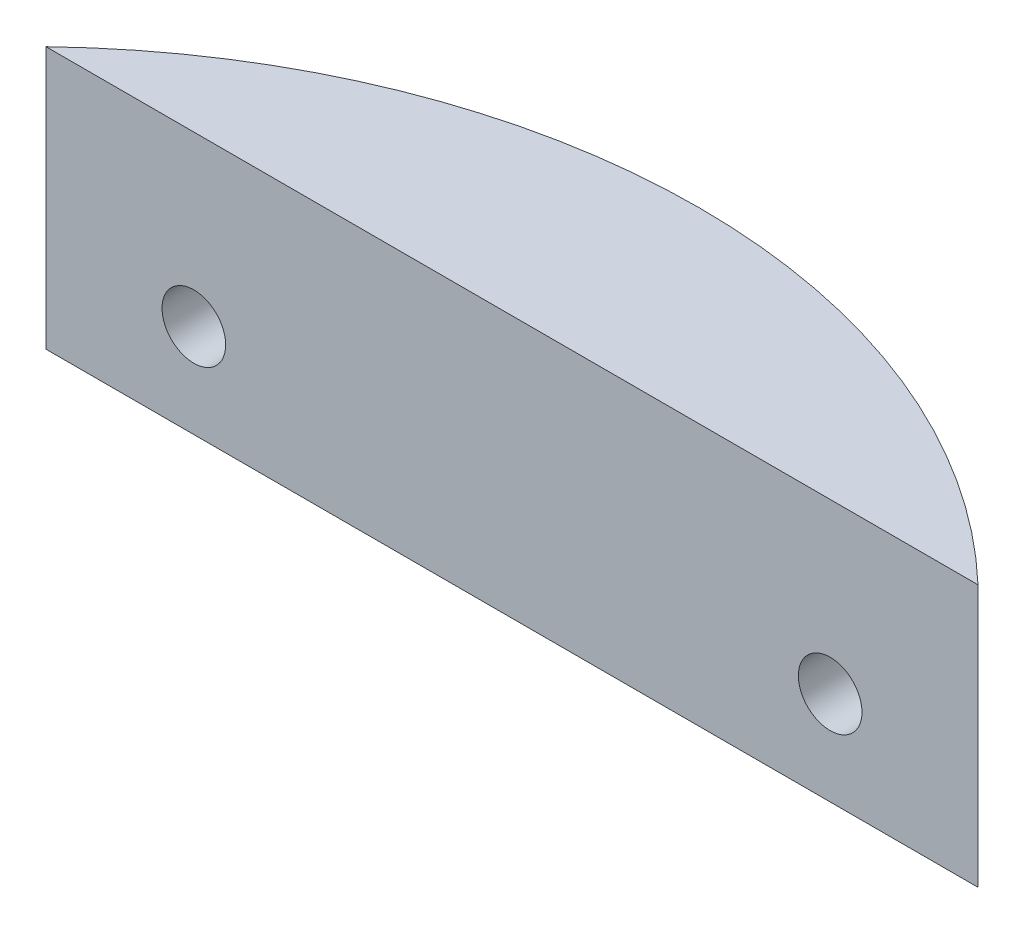
ISO-10303-21;
HEADER;
FILE_DESCRIPTION(('STEP AP214'),'2;1');
FILE_NAME('part.step','',(''),(''),'','','');
FILE_SCHEMA(('AUTOMOTIVE_DESIGN { 1 0 10303 214 1 1 1 1 }'));
ENDSEC;
DATA;
#1=APPLICATION_CONTEXT('core data for automotive mechanical design processes');
#2=APPLICATION_PROTOCOL_DEFINITION('international standard','automotive_design',2000,#1);
#3=PRODUCT_CONTEXT('',#1,'mechanical');
#4=PRODUCT('Part','Part','',(#3));
#5=PRODUCT_RELATED_PRODUCT_CATEGORY('part','',(#4));
#6=PRODUCT_DEFINITION_FORMATION('','',#4);
#7=PRODUCT_DEFINITION_CONTEXT('part definition',#1,'design');
#8=PRODUCT_DEFINITION('design','',#6,#7);
#9=PRODUCT_DEFINITION_SHAPE('','',#8);
#10=(LENGTH_UNIT() NAMED_UNIT(*) SI_UNIT(.MILLI.,.METRE.));
#11=(NAMED_UNIT(*) PLANE_ANGLE_UNIT() SI_UNIT($,.RADIAN.));
#12=(NAMED_UNIT(*) SI_UNIT($,.STERADIAN.) SOLID_ANGLE_UNIT());
#13=UNCERTAINTY_MEASURE_WITH_UNIT(LENGTH_MEASURE(1.E-05),#10,'distance_accuracy_value','');
#14=(GEOMETRIC_REPRESENTATION_CONTEXT(3) GLOBAL_UNCERTAINTY_ASSIGNED_CONTEXT((#13)) GLOBAL_UNIT_ASSIGNED_CONTEXT((#10,
#11,#12)) REPRESENTATION_CONTEXT('',''));
#15=CARTESIAN_POINT('',(0.,0.,0.));
#16=DIRECTION('',(0.,0.,1.));
#17=DIRECTION('',(1.,0.,0.));
#18=AXIS2_PLACEMENT_3D('',#15,#16,#17);
#19=CARTESIAN_POINT('',(0.,35.,0.));
#20=DIRECTION('',(0.,-1.,0.));
#21=DIRECTION('',(0.,0.,-1.));
#22=AXIS2_PLACEMENT_3D('',#19,#20,#21);
#23=CYLINDRICAL_SURFACE('',#22,90.);
#24=CARTESIAN_POINT('',(0.,0.,0.));
#25=DIRECTION('',(0.,1.,0.));
#26=DIRECTION('',(0.,0.,-1.));
#27=AXIS2_PLACEMENT_3D('',#24,#25,#26);
#28=CIRCLE('',#27,90.);
#29=CARTESIAN_POINT('',(62.2494979899437,0.,-65.));
#30=VERTEX_POINT('',#29);
#31=CARTESIAN_POINT('',(-62.2494979899437,0.,-65.));
#32=VERTEX_POINT('',#31);
#33=EDGE_CURVE('E66',#30,#32,#28,.T.);
#34=ORIENTED_EDGE('',*,*,#33,.T.);
#35=DIRECTION('',(0.,-1.,0.));
#36=VECTOR('',#35,1.);
#37=CARTESIAN_POINT('',(-62.2494979899437,35.,-65.));
#38=LINE('',#37,#36);
#39=CARTESIAN_POINT('',(-62.2494979899437,35.,-65.));
#40=VERTEX_POINT('',#39);
#41=EDGE_CURVE('E11',#40,#32,#38,.T.);
#42=ORIENTED_EDGE('',*,*,#41,.F.);
#43=CARTESIAN_POINT('',(0.,35.,0.));
#44=DIRECTION('',(0.,1.,0.));
#45=DIRECTION('',(0.,0.,-1.));
#46=AXIS2_PLACEMENT_3D('',#43,#44,#45);
#47=CIRCLE('',#46,90.);
#48=CARTESIAN_POINT('',(62.2494979899437,35.,-65.));
#49=VERTEX_POINT('',#48);
#50=EDGE_CURVE('E65',#49,#40,#47,.T.);
#51=ORIENTED_EDGE('',*,*,#50,.F.);
#52=DIRECTION('',(0.,-1.,0.));
#53=VECTOR('',#52,1.);
#54=CARTESIAN_POINT('',(62.2494979899437,35.,-65.));
#55=LINE('',#54,#53);
#56=EDGE_CURVE('E43',#49,#30,#55,.T.);
#57=ORIENTED_EDGE('',*,*,#56,.T.);
#58=EDGE_LOOP('',(#34,#42,#51,#57));
#59=FACE_BOUND('',#58,.T.);
#60=ADVANCED_FACE('F35',(#59),#23,.T.);
#61=CARTESIAN_POINT('',(-62.2494979899437,35.,-65.));
#62=DIRECTION('',(0.,0.,-1.));
#63=DIRECTION('',(-1.,0.,0.));
#64=AXIS2_PLACEMENT_3D('',#61,#62,#63);
#65=PLANE('',#64);
#66=CARTESIAN_POINT('',(42.5,12.5,-65.));
#67=DIRECTION('',(0.,0.,1.));
#68=DIRECTION('',(1.,0.,0.));
#69=AXIS2_PLACEMENT_3D('',#66,#67,#68);
#70=CIRCLE('',#69,4.25000000000001);
#71=CARTESIAN_POINT('',(46.75,12.5,-65.));
#72=VERTEX_POINT('',#71);
#73=EDGE_CURVE('E81',#72,#72,#70,.T.);
#74=ORIENTED_EDGE('',*,*,#73,.F.);
#75=EDGE_LOOP('',(#74));
#76=FACE_BOUND('',#75,.T.);
#77=CARTESIAN_POINT('',(-42.5,12.5,-65.));
#78=DIRECTION('',(0.,0.,1.));
#79=DIRECTION('',(1.,0.,0.));
#80=AXIS2_PLACEMENT_3D('',#77,#78,#79);
#81=CIRCLE('',#80,4.25000000000001);
#82=CARTESIAN_POINT('',(-38.25,12.5,-65.));
#83=VERTEX_POINT('',#82);
#84=EDGE_CURVE('E73',#83,#83,#81,.T.);
#85=ORIENTED_EDGE('',*,*,#84,.F.);
#86=EDGE_LOOP('',(#85));
#87=FACE_BOUND('',#86,.T.);
#88=DIRECTION('',(1.,0.,0.));
#89=VECTOR('',#88,1.);
#90=CARTESIAN_POINT('',(-62.2494979899437,0.,-65.));
#91=LINE('',#90,#89);
#92=EDGE_CURVE('E58',#32,#30,#91,.T.);
#93=ORIENTED_EDGE('',*,*,#92,.T.);
#94=ORIENTED_EDGE('',*,*,#56,.F.);
#95=DIRECTION('',(1.,0.,0.));
#96=VECTOR('',#95,1.);
#97=CARTESIAN_POINT('',(-62.2494979899437,35.,-65.));
#98=LINE('',#97,#96);
#99=EDGE_CURVE('E50',#40,#49,#98,.T.);
#100=ORIENTED_EDGE('',*,*,#99,.F.);
#101=ORIENTED_EDGE('',*,*,#41,.T.);
#102=EDGE_LOOP('',(#93,#94,#100,#101));
#103=FACE_BOUND('',#102,.T.);
#104=ADVANCED_FACE('F61',(#76,#87,#103),#65,.F.);
#105=CARTESIAN_POINT('',(0.,35.,0.));
#106=DIRECTION('',(0.,-1.,0.));
#107=DIRECTION('',(0.,0.,-1.));
#108=AXIS2_PLACEMENT_3D('',#105,#106,#107);
#109=PLANE('',#108);
#110=ORIENTED_EDGE('',*,*,#50,.T.);
#111=ORIENTED_EDGE('',*,*,#99,.T.);
#112=EDGE_LOOP('',(#110,#111));
#113=FACE_BOUND('',#112,.T.);
#114=ADVANCED_FACE('F98',(#113),#109,.F.);
#115=CARTESIAN_POINT('',(0.,0.,0.));
#116=DIRECTION('',(0.,-1.,0.));
#117=DIRECTION('',(0.,0.,-1.));
#118=AXIS2_PLACEMENT_3D('',#115,#116,#117);
#119=PLANE('',#118);
#120=ORIENTED_EDGE('',*,*,#33,.F.);
#121=ORIENTED_EDGE('',*,*,#92,.F.);
#122=EDGE_LOOP('',(#120,#121));
#123=FACE_BOUND('',#122,.T.);
#124=ADVANCED_FACE('F69',(#123),#119,.T.);
#125=CARTESIAN_POINT('',(-42.5,12.5,-75.));
#126=DIRECTION('',(0.,0.,1.));
#127=DIRECTION('',(1.,0.,0.));
#128=AXIS2_PLACEMENT_3D('',#125,#126,#127);
#129=CYLINDRICAL_SURFACE('',#128,4.25000000000001);
#130=CARTESIAN_POINT('',(-42.5,12.5,-75.));
#131=DIRECTION('',(0.,0.,1.));
#132=DIRECTION('',(1.,0.,0.));
#133=AXIS2_PLACEMENT_3D('',#130,#131,#132);
#134=CIRCLE('',#133,4.25000000000001);
#135=CARTESIAN_POINT('',(-38.25,12.5,-75.));
#136=VERTEX_POINT('',#135);
#137=EDGE_CURVE('E70',#136,#136,#134,.T.);
#138=ORIENTED_EDGE('',*,*,#137,.F.);
#139=EDGE_LOOP('',(#138));
#140=FACE_BOUND('',#139,.T.);
#141=ORIENTED_EDGE('',*,*,#84,.T.);
#142=EDGE_LOOP('',(#141));
#143=FACE_BOUND('',#142,.T.);
#144=ADVANCED_FACE('F101',(#140,#143),#129,.F.);
#145=CARTESIAN_POINT('',(-42.5,12.5,-75.));
#146=DIRECTION('',(0.,0.,1.));
#147=DIRECTION('',(1.,0.,0.));
#148=AXIS2_PLACEMENT_3D('',#145,#146,#147);
#149=PLANE('',#148);
#150=ORIENTED_EDGE('',*,*,#137,.T.);
#151=EDGE_LOOP('',(#150));
#152=FACE_BOUND('',#151,.T.);
#153=ADVANCED_FACE('F92',(#152),#149,.T.);
#154=CARTESIAN_POINT('',(42.5,12.5,-75.));
#155=DIRECTION('',(0.,0.,1.));
#156=DIRECTION('',(1.,0.,0.));
#157=AXIS2_PLACEMENT_3D('',#154,#155,#156);
#158=CYLINDRICAL_SURFACE('',#157,4.25000000000001);
#159=CARTESIAN_POINT('',(42.5,12.5,-75.));
#160=DIRECTION('',(0.,0.,1.));
#161=DIRECTION('',(1.,0.,0.));
#162=AXIS2_PLACEMENT_3D('',#159,#160,#161);
#163=CIRCLE('',#162,4.25000000000001);
#164=CARTESIAN_POINT('',(46.75,12.5,-75.));
#165=VERTEX_POINT('',#164);
#166=EDGE_CURVE('E79',#165,#165,#163,.T.);
#167=ORIENTED_EDGE('',*,*,#166,.F.);
#168=EDGE_LOOP('',(#167));
#169=FACE_BOUND('',#168,.T.);
#170=ORIENTED_EDGE('',*,*,#73,.T.);
#171=EDGE_LOOP('',(#170));
#172=FACE_BOUND('',#171,.T.);
#173=ADVANCED_FACE('F89',(#169,#172),#158,.F.);
#174=CARTESIAN_POINT('',(42.5,12.5,-75.));
#175=DIRECTION('',(0.,0.,1.));
#176=DIRECTION('',(1.,0.,0.));
#177=AXIS2_PLACEMENT_3D('',#174,#175,#176);
#178=PLANE('',#177);
#179=ORIENTED_EDGE('',*,*,#166,.T.);
#180=EDGE_LOOP('',(#179));
#181=FACE_BOUND('',#180,.T.);
#182=ADVANCED_FACE('F87',(#181),#178,.T.);
#183=CLOSED_SHELL('',(#60,#104,#114,#124,#144,#153,#173,#182));
#184=MANIFOLD_SOLID_BREP('B2',#183);
#185=ADVANCED_BREP_SHAPE_REPRESENTATION('',(#18,#184),#14);
#186=SHAPE_DEFINITION_REPRESENTATION(#9,#185);
ENDSEC;
END-ISO-10303-21;
